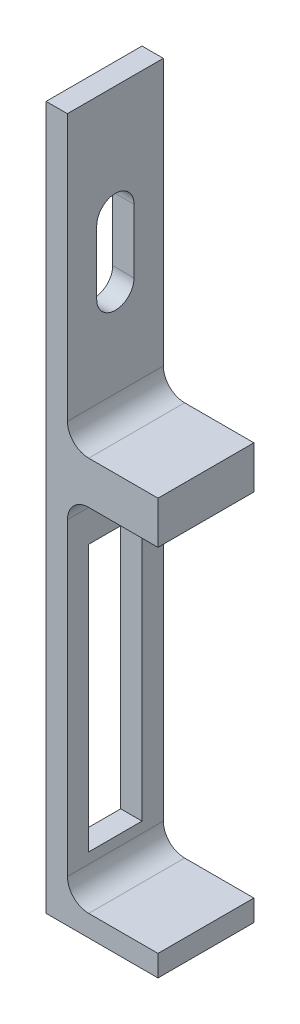
ISO-10303-21;
HEADER;
FILE_DESCRIPTION(('STEP AP214'),'2;1');
FILE_NAME('part.step','',(''),(''),'','','');
FILE_SCHEMA(('AUTOMOTIVE_DESIGN { 1 0 10303 214 1 1 1 1 }'));
ENDSEC;
DATA;
#1=APPLICATION_CONTEXT('core data for automotive mechanical design processes');
#2=APPLICATION_PROTOCOL_DEFINITION('international standard','automotive_design',2000,#1);
#3=PRODUCT_CONTEXT('',#1,'mechanical');
#4=PRODUCT('Part','Part','',(#3));
#5=PRODUCT_RELATED_PRODUCT_CATEGORY('part','',(#4));
#6=PRODUCT_DEFINITION_FORMATION('','',#4);
#7=PRODUCT_DEFINITION_CONTEXT('part definition',#1,'design');
#8=PRODUCT_DEFINITION('design','',#6,#7);
#9=PRODUCT_DEFINITION_SHAPE('','',#8);
#10=(LENGTH_UNIT() NAMED_UNIT(*) SI_UNIT(.MILLI.,.METRE.));
#11=(NAMED_UNIT(*) PLANE_ANGLE_UNIT() SI_UNIT($,.RADIAN.));
#12=(NAMED_UNIT(*) SI_UNIT($,.STERADIAN.) SOLID_ANGLE_UNIT());
#13=UNCERTAINTY_MEASURE_WITH_UNIT(LENGTH_MEASURE(1.E-05),#10,'distance_accuracy_value','');
#14=(GEOMETRIC_REPRESENTATION_CONTEXT(3) GLOBAL_UNCERTAINTY_ASSIGNED_CONTEXT((#13)) GLOBAL_UNIT_ASSIGNED_CONTEXT((#10,
#11,#12)) REPRESENTATION_CONTEXT('',''));
#15=CARTESIAN_POINT('',(0.,0.,0.));
#16=DIRECTION('',(0.,0.,1.));
#17=DIRECTION('',(1.,0.,0.));
#18=AXIS2_PLACEMENT_3D('',#15,#16,#17);
#19=CARTESIAN_POINT('',(2.,2.,9.));
#20=DIRECTION('',(-1.,0.,0.));
#21=DIRECTION('',(0.,0.,1.));
#22=AXIS2_PLACEMENT_3D('',#19,#20,#21);
#23=PLANE('',#22);
#24=DIRECTION('',(0.,1.,0.));
#25=VECTOR('',#24,1.);
#26=CARTESIAN_POINT('',(2.,2.,6.25000000000002));
#27=LINE('',#26,#25);
#28=CARTESIAN_POINT('',(2.,49.52,6.25000000000001));
#29=VERTEX_POINT('',#28);
#30=CARTESIAN_POINT('',(2.,55.52,6.25000000000001));
#31=VERTEX_POINT('',#30);
#32=EDGE_CURVE('E305',#29,#31,#27,.T.);
#33=ORIENTED_EDGE('',*,*,#32,.T.);
#34=CARTESIAN_POINT('',(2.,55.52,4.5));
#35=DIRECTION('',(-1.,0.,0.));
#36=DIRECTION('',(0.,0.,1.));
#37=AXIS2_PLACEMENT_3D('',#34,#35,#36);
#38=CIRCLE('',#37,1.75);
#39=CARTESIAN_POINT('',(2.,55.52,2.75));
#40=VERTEX_POINT('',#39);
#41=EDGE_CURVE('E308',#31,#40,#38,.T.);
#42=ORIENTED_EDGE('',*,*,#41,.T.);
#43=DIRECTION('',(0.,-1.,0.));
#44=VECTOR('',#43,1.);
#45=CARTESIAN_POINT('',(2.,2.,2.75000000000002));
#46=LINE('',#45,#44);
#47=CARTESIAN_POINT('',(2.,49.52,2.75));
#48=VERTEX_POINT('',#47);
#49=EDGE_CURVE('E299',#40,#48,#46,.T.);
#50=ORIENTED_EDGE('',*,*,#49,.T.);
#51=CARTESIAN_POINT('',(2.,49.52,4.50000000000001));
#52=DIRECTION('',(-1.,0.,0.));
#53=DIRECTION('',(0.,0.,1.));
#54=AXIS2_PLACEMENT_3D('',#51,#52,#53);
#55=CIRCLE('',#54,1.75);
#56=EDGE_CURVE('E302',#48,#29,#55,.T.);
#57=ORIENTED_EDGE('',*,*,#56,.T.);
#58=EDGE_LOOP('',(#33,#42,#50,#57));
#59=FACE_BOUND('',#58,.T.);
#60=DIRECTION('',(0.,1.,0.));
#61=VECTOR('',#60,1.);
#62=CARTESIAN_POINT('',(2.,2.,9.));
#63=LINE('',#62,#61);
#64=CARTESIAN_POINT('',(2.,41.,9.));
#65=VERTEX_POINT('',#64);
#66=CARTESIAN_POINT('',(2.,66.,9.));
#67=VERTEX_POINT('',#66);
#68=EDGE_CURVE('E265',#65,#67,#63,.T.);
#69=ORIENTED_EDGE('',*,*,#68,.F.);
#70=DIRECTION('',(0.,0.,1.));
#71=VECTOR('',#70,1.);
#72=CARTESIAN_POINT('',(2.,41.,9.));
#73=LINE('',#72,#71);
#74=CARTESIAN_POINT('',(2.,41.,0.));
#75=VERTEX_POINT('',#74);
#76=EDGE_CURVE('E323',#65,#75,#73,.F.);
#77=ORIENTED_EDGE('',*,*,#76,.T.);
#78=DIRECTION('',(0.,1.,0.));
#79=VECTOR('',#78,1.);
#80=CARTESIAN_POINT('',(2.,2.,0.));
#81=LINE('',#80,#79);
#82=CARTESIAN_POINT('',(2.,66.,0.));
#83=VERTEX_POINT('',#82);
#84=EDGE_CURVE('E280',#75,#83,#81,.T.);
#85=ORIENTED_EDGE('',*,*,#84,.T.);
#86=DIRECTION('',(0.,0.,-1.));
#87=VECTOR('',#86,1.);
#88=CARTESIAN_POINT('',(2.,66.,9.));
#89=LINE('',#88,#87);
#90=EDGE_CURVE('E287',#67,#83,#89,.T.);
#91=ORIENTED_EDGE('',*,*,#90,.F.);
#92=EDGE_LOOP('',(#69,#77,#85,#91));
#93=FACE_BOUND('',#92,.T.);
#94=ADVANCED_FACE('F37',(#59,#93),#23,.F.);
#95=CARTESIAN_POINT('',(0.,66.,9.));
#96=DIRECTION('',(1.,0.,0.));
#97=DIRECTION('',(0.,1.,0.));
#98=AXIS2_PLACEMENT_3D('',#95,#96,#97);
#99=PLANE('',#98);
#100=DIRECTION('',(0.,0.,1.));
#101=VECTOR('',#100,1.);
#102=CARTESIAN_POINT('',(0.,30.,7.));
#103=LINE('',#102,#101);
#104=CARTESIAN_POINT('',(0.,30.,2.00000000000001));
#105=VERTEX_POINT('',#104);
#106=CARTESIAN_POINT('',(0.,30.,7.));
#107=VERTEX_POINT('',#106);
#108=EDGE_CURVE('E211',#105,#107,#103,.T.);
#109=ORIENTED_EDGE('',*,*,#108,.T.);
#110=DIRECTION('',(0.,-1.,0.));
#111=VECTOR('',#110,1.);
#112=CARTESIAN_POINT('',(0.,5.,7.));
#113=LINE('',#112,#111);
#114=CARTESIAN_POINT('',(0.,5.,7.));
#115=VERTEX_POINT('',#114);
#116=EDGE_CURVE('E201',#107,#115,#113,.T.);
#117=ORIENTED_EDGE('',*,*,#116,.T.);
#118=DIRECTION('',(0.,0.,-1.));
#119=VECTOR('',#118,1.);
#120=CARTESIAN_POINT('',(0.,5.,7.));
#121=LINE('',#120,#119);
#122=CARTESIAN_POINT('',(0.,5.,2.00000000000001));
#123=VERTEX_POINT('',#122);
#124=EDGE_CURVE('E204',#115,#123,#121,.T.);
#125=ORIENTED_EDGE('',*,*,#124,.T.);
#126=DIRECTION('',(0.,1.,0.));
#127=VECTOR('',#126,1.);
#128=CARTESIAN_POINT('',(0.,5.,2.00000000000001));
#129=LINE('',#128,#127);
#130=EDGE_CURVE('E208',#123,#105,#129,.T.);
#131=ORIENTED_EDGE('',*,*,#130,.T.);
#132=EDGE_LOOP('',(#109,#117,#125,#131));
#133=FACE_BOUND('',#132,.T.);
#134=DIRECTION('',(0.,-1.,0.));
#135=VECTOR('',#134,1.);
#136=CARTESIAN_POINT('',(0.,55.52,2.75));
#137=LINE('',#136,#135);
#138=CARTESIAN_POINT('',(0.,55.52,2.75));
#139=VERTEX_POINT('',#138);
#140=CARTESIAN_POINT('',(0.,49.52,2.75));
#141=VERTEX_POINT('',#140);
#142=EDGE_CURVE('E236',#139,#141,#137,.T.);
#143=ORIENTED_EDGE('',*,*,#142,.F.);
#144=CARTESIAN_POINT('',(0.,55.52,4.5));
#145=DIRECTION('',(-1.,0.,0.));
#146=DIRECTION('',(0.,-1.,0.));
#147=AXIS2_PLACEMENT_3D('',#144,#145,#146);
#148=CIRCLE('',#147,1.75);
#149=CARTESIAN_POINT('',(0.,55.52,6.25000000000001));
#150=VERTEX_POINT('',#149);
#151=EDGE_CURVE('E228',#150,#139,#148,.T.);
#152=ORIENTED_EDGE('',*,*,#151,.F.);
#153=DIRECTION('',(0.,1.,0.));
#154=VECTOR('',#153,1.);
#155=CARTESIAN_POINT('',(0.,55.52,6.25000000000001));
#156=LINE('',#155,#154);
#157=CARTESIAN_POINT('',(0.,49.52,6.25000000000001));
#158=VERTEX_POINT('',#157);
#159=EDGE_CURVE('E242',#158,#150,#156,.T.);
#160=ORIENTED_EDGE('',*,*,#159,.F.);
#161=CARTESIAN_POINT('',(0.,49.52,4.50000000000001));
#162=DIRECTION('',(-1.,0.,0.));
#163=DIRECTION('',(0.,-1.,0.));
#164=AXIS2_PLACEMENT_3D('',#161,#162,#163);
#165=CIRCLE('',#164,1.75);
#166=EDGE_CURVE('E239',#141,#158,#165,.T.);
#167=ORIENTED_EDGE('',*,*,#166,.F.);
#168=EDGE_LOOP('',(#143,#152,#160,#167));
#169=FACE_BOUND('',#168,.T.);
#170=DIRECTION('',(0.,-1.,0.));
#171=VECTOR('',#170,1.);
#172=CARTESIAN_POINT('',(0.,66.,0.));
#173=LINE('',#172,#171);
#174=CARTESIAN_POINT('',(0.,66.,0.));
#175=VERTEX_POINT('',#174);
#176=CARTESIAN_POINT('',(0.,0.,0.));
#177=VERTEX_POINT('',#176);
#178=EDGE_CURVE('E248',#175,#177,#173,.T.);
#179=ORIENTED_EDGE('',*,*,#178,.T.);
#180=DIRECTION('',(0.,0.,-1.));
#181=VECTOR('',#180,1.);
#182=CARTESIAN_POINT('',(0.,0.,9.));
#183=LINE('',#182,#181);
#184=CARTESIAN_POINT('',(0.,0.,9.));
#185=VERTEX_POINT('',#184);
#186=EDGE_CURVE('E296',#185,#177,#183,.T.);
#187=ORIENTED_EDGE('',*,*,#186,.F.);
#188=DIRECTION('',(0.,-1.,0.));
#189=VECTOR('',#188,1.);
#190=CARTESIAN_POINT('',(0.,66.,9.));
#191=LINE('',#190,#189);
#192=CARTESIAN_POINT('',(0.,66.,9.));
#193=VERTEX_POINT('',#192);
#194=EDGE_CURVE('E255',#193,#185,#191,.T.);
#195=ORIENTED_EDGE('',*,*,#194,.F.);
#196=DIRECTION('',(0.,0.,-1.));
#197=VECTOR('',#196,1.);
#198=CARTESIAN_POINT('',(0.,66.,9.));
#199=LINE('',#198,#197);
#200=EDGE_CURVE('E270',#193,#175,#199,.T.);
#201=ORIENTED_EDGE('',*,*,#200,.T.);
#202=EDGE_LOOP('',(#179,#187,#195,#201));
#203=FACE_BOUND('',#202,.T.);
#204=ADVANCED_FACE('F358',(#133,#169,#203),#99,.F.);
#205=CARTESIAN_POINT('',(0.,0.,9.));
#206=DIRECTION('',(0.,1.,0.));
#207=DIRECTION('',(0.,0.,1.));
#208=AXIS2_PLACEMENT_3D('',#205,#206,#207);
#209=PLANE('',#208);
#210=DIRECTION('',(1.,0.,0.));
#211=VECTOR('',#210,1.);
#212=CARTESIAN_POINT('',(0.,0.,0.));
#213=LINE('',#212,#211);
#214=CARTESIAN_POINT('',(10.5,0.,0.));
#215=VERTEX_POINT('',#214);
#216=EDGE_CURVE('E273',#177,#215,#213,.T.);
#217=ORIENTED_EDGE('',*,*,#216,.T.);
#218=DIRECTION('',(0.,0.,-1.));
#219=VECTOR('',#218,1.);
#220=CARTESIAN_POINT('',(10.5,0.,9.));
#221=LINE('',#220,#219);
#222=CARTESIAN_POINT('',(10.5,0.,9.));
#223=VERTEX_POINT('',#222);
#224=EDGE_CURVE('E293',#223,#215,#221,.T.);
#225=ORIENTED_EDGE('',*,*,#224,.F.);
#226=DIRECTION('',(1.,0.,0.));
#227=VECTOR('',#226,1.);
#228=CARTESIAN_POINT('',(0.,0.,9.));
#229=LINE('',#228,#227);
#230=EDGE_CURVE('E257',#185,#223,#229,.T.);
#231=ORIENTED_EDGE('',*,*,#230,.F.);
#232=ORIENTED_EDGE('',*,*,#186,.T.);
#233=EDGE_LOOP('',(#217,#225,#231,#232));
#234=FACE_BOUND('',#233,.T.);
#235=ADVANCED_FACE('F360',(#234),#209,.F.);
#236=CARTESIAN_POINT('',(10.5,0.,9.));
#237=DIRECTION('',(-1.,0.,0.));
#238=DIRECTION('',(0.,0.,1.));
#239=AXIS2_PLACEMENT_3D('',#236,#237,#238);
#240=PLANE('',#239);
#241=DIRECTION('',(0.,1.,0.));
#242=VECTOR('',#241,1.);
#243=CARTESIAN_POINT('',(10.5,0.,0.));
#244=LINE('',#243,#242);
#245=CARTESIAN_POINT('',(10.5,2.,0.));
#246=VERTEX_POINT('',#245);
#247=EDGE_CURVE('E275',#215,#246,#244,.T.);
#248=ORIENTED_EDGE('',*,*,#247,.T.);
#249=DIRECTION('',(0.,0.,-1.));
#250=VECTOR('',#249,1.);
#251=CARTESIAN_POINT('',(10.5,2.,9.));
#252=LINE('',#251,#250);
#253=CARTESIAN_POINT('',(10.5,2.,9.));
#254=VERTEX_POINT('',#253);
#255=EDGE_CURVE('E290',#254,#246,#252,.T.);
#256=ORIENTED_EDGE('',*,*,#255,.F.);
#257=DIRECTION('',(0.,1.,0.));
#258=VECTOR('',#257,1.);
#259=CARTESIAN_POINT('',(10.5,0.,9.));
#260=LINE('',#259,#258);
#261=EDGE_CURVE('E260',#223,#254,#260,.T.);
#262=ORIENTED_EDGE('',*,*,#261,.F.);
#263=ORIENTED_EDGE('',*,*,#224,.T.);
#264=EDGE_LOOP('',(#248,#256,#262,#263));
#265=FACE_BOUND('',#264,.T.);
#266=ADVANCED_FACE('F365',(#265),#240,.F.);
#267=CARTESIAN_POINT('',(10.5,2.,9.));
#268=DIRECTION('',(0.,-1.,0.));
#269=DIRECTION('',(1.,0.,0.));
#270=AXIS2_PLACEMENT_3D('',#267,#268,#269);
#271=PLANE('',#270);
#272=DIRECTION('',(-1.,0.,0.));
#273=VECTOR('',#272,1.);
#274=CARTESIAN_POINT('',(10.5,2.,0.));
#275=LINE('',#274,#273);
#276=CARTESIAN_POINT('',(4.,2.,0.));
#277=VERTEX_POINT('',#276);
#278=EDGE_CURVE('E277',#246,#277,#275,.T.);
#279=ORIENTED_EDGE('',*,*,#278,.T.);
#280=DIRECTION('',(0.,0.,-1.));
#281=VECTOR('',#280,1.);
#282=CARTESIAN_POINT('',(4.,2.,9.));
#283=LINE('',#282,#281);
#284=CARTESIAN_POINT('',(4.,2.,9.));
#285=VERTEX_POINT('',#284);
#286=EDGE_CURVE('E314',#277,#285,#283,.F.);
#287=ORIENTED_EDGE('',*,*,#286,.T.);
#288=DIRECTION('',(-1.,0.,0.));
#289=VECTOR('',#288,1.);
#290=CARTESIAN_POINT('',(10.5,2.,9.));
#291=LINE('',#290,#289);
#292=EDGE_CURVE('E262',#254,#285,#291,.T.);
#293=ORIENTED_EDGE('',*,*,#292,.F.);
#294=ORIENTED_EDGE('',*,*,#255,.T.);
#295=EDGE_LOOP('',(#279,#287,#293,#294));
#296=FACE_BOUND('',#295,.T.);
#297=ADVANCED_FACE('F396',(#296),#271,.F.);
#298=DIRECTION('',(0.,0.,-1.));
#299=VECTOR('',#298,1.);
#300=CARTESIAN_POINT('',(2.,5.,7.));
#301=LINE('',#300,#299);
#302=CARTESIAN_POINT('',(2.,5.,7.));
#303=VERTEX_POINT('',#302);
#304=CARTESIAN_POINT('',(2.,5.,2.00000000000001));
#305=VERTEX_POINT('',#304);
#306=EDGE_CURVE('E217',#303,#305,#301,.T.);
#307=ORIENTED_EDGE('',*,*,#306,.F.);
#308=DIRECTION('',(0.,-1.,0.));
#309=VECTOR('',#308,1.);
#310=CARTESIAN_POINT('',(2.,5.,7.));
#311=LINE('',#310,#309);
#312=CARTESIAN_POINT('',(2.,30.,7.));
#313=VERTEX_POINT('',#312);
#314=EDGE_CURVE('E215',#313,#303,#311,.T.);
#315=ORIENTED_EDGE('',*,*,#314,.F.);
#316=DIRECTION('',(0.,0.,1.));
#317=VECTOR('',#316,1.);
#318=CARTESIAN_POINT('',(2.,30.,7.));
#319=LINE('',#318,#317);
#320=CARTESIAN_POINT('',(2.,30.,2.00000000000001));
#321=VERTEX_POINT('',#320);
#322=EDGE_CURVE('E205',#321,#313,#319,.T.);
#323=ORIENTED_EDGE('',*,*,#322,.F.);
#324=DIRECTION('',(0.,1.,0.));
#325=VECTOR('',#324,1.);
#326=CARTESIAN_POINT('',(2.,5.,2.00000000000001));
#327=LINE('',#326,#325);
#328=EDGE_CURVE('E221',#305,#321,#327,.T.);
#329=ORIENTED_EDGE('',*,*,#328,.F.);
#330=EDGE_LOOP('',(#307,#315,#323,#329));
#331=FACE_BOUND('',#330,.T.);
#332=CARTESIAN_POINT('',(2.,4.,0.));
#333=VERTEX_POINT('',#332);
#334=CARTESIAN_POINT('',(2.,33.,0.));
#335=VERTEX_POINT('',#334);
#336=EDGE_CURVE('E281',#333,#335,#81,.T.);
#337=ORIENTED_EDGE('',*,*,#336,.T.);
#338=DIRECTION('',(0.,0.,1.));
#339=VECTOR('',#338,1.);
#340=CARTESIAN_POINT('',(2.,33.,9.));
#341=LINE('',#340,#339);
#342=CARTESIAN_POINT('',(2.,33.,9.));
#343=VERTEX_POINT('',#342);
#344=EDGE_CURVE('E325',#335,#343,#341,.T.);
#345=ORIENTED_EDGE('',*,*,#344,.T.);
#346=CARTESIAN_POINT('',(2.,4.,9.));
#347=VERTEX_POINT('',#346);
#348=EDGE_CURVE('E266',#347,#343,#63,.T.);
#349=ORIENTED_EDGE('',*,*,#348,.F.);
#350=DIRECTION('',(0.,0.,-1.));
#351=VECTOR('',#350,1.);
#352=CARTESIAN_POINT('',(2.,4.,0.));
#353=LINE('',#352,#351);
#354=EDGE_CURVE('E311',#347,#333,#353,.T.);
#355=ORIENTED_EDGE('',*,*,#354,.T.);
#356=EDGE_LOOP('',(#337,#345,#349,#355));
#357=FACE_BOUND('',#356,.T.);
#358=ADVANCED_FACE('F376',(#331,#357),#23,.F.);
#359=CARTESIAN_POINT('',(2.,66.,9.));
#360=DIRECTION('',(0.,-1.,0.));
#361=DIRECTION('',(0.,0.,-1.));
#362=AXIS2_PLACEMENT_3D('',#359,#360,#361);
#363=PLANE('',#362);
#364=DIRECTION('',(-1.,0.,0.));
#365=VECTOR('',#364,1.);
#366=CARTESIAN_POINT('',(2.,66.,0.));
#367=LINE('',#366,#365);
#368=EDGE_CURVE('E258',#83,#175,#367,.T.);
#369=ORIENTED_EDGE('',*,*,#368,.T.);
#370=ORIENTED_EDGE('',*,*,#200,.F.);
#371=DIRECTION('',(-1.,0.,0.));
#372=VECTOR('',#371,1.);
#373=CARTESIAN_POINT('',(2.,66.,9.));
#374=LINE('',#373,#372);
#375=EDGE_CURVE('E268',#67,#193,#374,.T.);
#376=ORIENTED_EDGE('',*,*,#375,.F.);
#377=ORIENTED_EDGE('',*,*,#90,.T.);
#378=EDGE_LOOP('',(#369,#370,#376,#377));
#379=FACE_BOUND('',#378,.T.);
#380=ADVANCED_FACE('F353',(#379),#363,.F.);
#381=CARTESIAN_POINT('',(0.,0.,9.));
#382=DIRECTION('',(0.,0.,1.));
#383=DIRECTION('',(1.,0.,0.));
#384=AXIS2_PLACEMENT_3D('',#381,#382,#383);
#385=PLANE('',#384);
#386=ORIENTED_EDGE('',*,*,#194,.T.);
#387=ORIENTED_EDGE('',*,*,#230,.T.);
#388=ORIENTED_EDGE('',*,*,#261,.T.);
#389=ORIENTED_EDGE('',*,*,#292,.T.);
#390=CARTESIAN_POINT('',(4.,4.,9.));
#391=DIRECTION('',(0.,0.,1.));
#392=DIRECTION('',(1.,0.,0.));
#393=AXIS2_PLACEMENT_3D('',#390,#391,#392);
#394=CIRCLE('',#393,2.);
#395=EDGE_CURVE('E318',#285,#347,#394,.F.);
#396=ORIENTED_EDGE('',*,*,#395,.T.);
#397=ORIENTED_EDGE('',*,*,#348,.T.);
#398=CARTESIAN_POINT('',(4.,33.,9.));
#399=DIRECTION('',(0.,0.,1.));
#400=DIRECTION('',(1.,0.,0.));
#401=AXIS2_PLACEMENT_3D('',#398,#399,#400);
#402=CIRCLE('',#401,2.);
#403=CARTESIAN_POINT('',(4.,35.,9.));
#404=VERTEX_POINT('',#403);
#405=EDGE_CURVE('E45',#343,#404,#402,.F.);
#406=ORIENTED_EDGE('',*,*,#405,.T.);
#407=DIRECTION('',(1.,0.,0.));
#408=VECTOR('',#407,1.);
#409=CARTESIAN_POINT('',(2.,35.,9.));
#410=LINE('',#409,#408);
#411=CARTESIAN_POINT('',(10.5,35.,9.));
#412=VERTEX_POINT('',#411);
#413=EDGE_CURVE('E177',#404,#412,#410,.T.);
#414=ORIENTED_EDGE('',*,*,#413,.T.);
#415=DIRECTION('',(0.,1.,0.));
#416=VECTOR('',#415,1.);
#417=CARTESIAN_POINT('',(10.5,39.,9.));
#418=LINE('',#417,#416);
#419=CARTESIAN_POINT('',(10.5,39.,9.));
#420=VERTEX_POINT('',#419);
#421=EDGE_CURVE('E183',#412,#420,#418,.T.);
#422=ORIENTED_EDGE('',*,*,#421,.T.);
#423=DIRECTION('',(-1.,0.,0.));
#424=VECTOR('',#423,1.);
#425=CARTESIAN_POINT('',(2.,39.,9.));
#426=LINE('',#425,#424);
#427=CARTESIAN_POINT('',(4.,39.,9.));
#428=VERTEX_POINT('',#427);
#429=EDGE_CURVE('E184',#420,#428,#426,.T.);
#430=ORIENTED_EDGE('',*,*,#429,.T.);
#431=CARTESIAN_POINT('',(4.,41.,9.));
#432=DIRECTION('',(0.,0.,1.));
#433=DIRECTION('',(1.,0.,0.));
#434=AXIS2_PLACEMENT_3D('',#431,#432,#433);
#435=CIRCLE('',#434,2.);
#436=EDGE_CURVE('E329',#428,#65,#435,.F.);
#437=ORIENTED_EDGE('',*,*,#436,.T.);
#438=ORIENTED_EDGE('',*,*,#68,.T.);
#439=ORIENTED_EDGE('',*,*,#375,.T.);
#440=EDGE_LOOP('',(#386,#387,#388,#389,#396,#397,#406,#414,#422,#430,#437,#438,#439));
#441=FACE_BOUND('',#440,.T.);
#442=ADVANCED_FACE('F180',(#441),#385,.T.);
#443=CARTESIAN_POINT('',(0.,0.,0.));
#444=DIRECTION('',(0.,0.,1.));
#445=DIRECTION('',(1.,0.,0.));
#446=AXIS2_PLACEMENT_3D('',#443,#444,#445);
#447=PLANE('',#446);
#448=ORIENTED_EDGE('',*,*,#178,.F.);
#449=ORIENTED_EDGE('',*,*,#368,.F.);
#450=ORIENTED_EDGE('',*,*,#84,.F.);
#451=CARTESIAN_POINT('',(4.,41.,0.));
#452=DIRECTION('',(0.,0.,1.));
#453=DIRECTION('',(1.,0.,0.));
#454=AXIS2_PLACEMENT_3D('',#451,#452,#453);
#455=CIRCLE('',#454,2.);
#456=CARTESIAN_POINT('',(4.,39.,0.));
#457=VERTEX_POINT('',#456);
#458=EDGE_CURVE('E331',#75,#457,#455,.T.);
#459=ORIENTED_EDGE('',*,*,#458,.T.);
#460=DIRECTION('',(1.,0.,0.));
#461=VECTOR('',#460,1.);
#462=CARTESIAN_POINT('',(2.,39.,0.));
#463=LINE('',#462,#461);
#464=CARTESIAN_POINT('',(10.5,39.,0.));
#465=VERTEX_POINT('',#464);
#466=EDGE_CURVE('E218',#457,#465,#463,.T.);
#467=ORIENTED_EDGE('',*,*,#466,.T.);
#468=DIRECTION('',(0.,-1.,0.));
#469=VECTOR('',#468,1.);
#470=CARTESIAN_POINT('',(10.5,39.,0.));
#471=LINE('',#470,#469);
#472=CARTESIAN_POINT('',(10.5,35.,0.));
#473=VERTEX_POINT('',#472);
#474=EDGE_CURVE('E344',#465,#473,#471,.T.);
#475=ORIENTED_EDGE('',*,*,#474,.T.);
#476=DIRECTION('',(-1.,0.,0.));
#477=VECTOR('',#476,1.);
#478=CARTESIAN_POINT('',(2.,35.,0.));
#479=LINE('',#478,#477);
#480=CARTESIAN_POINT('',(4.,35.,0.));
#481=VERTEX_POINT('',#480);
#482=EDGE_CURVE('E189',#473,#481,#479,.T.);
#483=ORIENTED_EDGE('',*,*,#482,.T.);
#484=CARTESIAN_POINT('',(4.,33.,0.));
#485=DIRECTION('',(0.,0.,1.));
#486=DIRECTION('',(1.,0.,0.));
#487=AXIS2_PLACEMENT_3D('',#484,#485,#486);
#488=CIRCLE('',#487,2.);
#489=EDGE_CURVE('E11',#481,#335,#488,.T.);
#490=ORIENTED_EDGE('',*,*,#489,.T.);
#491=ORIENTED_EDGE('',*,*,#336,.F.);
#492=CARTESIAN_POINT('',(4.,4.,0.));
#493=DIRECTION('',(0.,0.,1.));
#494=DIRECTION('',(1.,0.,0.));
#495=AXIS2_PLACEMENT_3D('',#492,#493,#494);
#496=CIRCLE('',#495,2.);
#497=EDGE_CURVE('E316',#333,#277,#496,.T.);
#498=ORIENTED_EDGE('',*,*,#497,.T.);
#499=ORIENTED_EDGE('',*,*,#278,.F.);
#500=ORIENTED_EDGE('',*,*,#247,.F.);
#501=ORIENTED_EDGE('',*,*,#216,.F.);
#502=EDGE_LOOP('',(#448,#449,#450,#459,#467,#475,#483,#490,#491,#498,#499,#500,#501));
#503=FACE_BOUND('',#502,.T.);
#504=ADVANCED_FACE('F337',(#503),#447,.F.);
#505=CARTESIAN_POINT('',(10.5,55.52,4.5));
#506=DIRECTION('',(-1.,0.,0.));
#507=DIRECTION('',(0.,-1.,0.));
#508=AXIS2_PLACEMENT_3D('',#505,#506,#507);
#509=CYLINDRICAL_SURFACE('',#508,1.75);
#510=DIRECTION('',(-1.,0.,0.));
#511=VECTOR('',#510,1.);
#512=CARTESIAN_POINT('',(10.5,55.52,6.25000000000001));
#513=LINE('',#512,#511);
#514=EDGE_CURVE('E246',#31,#150,#513,.T.);
#515=ORIENTED_EDGE('',*,*,#514,.T.);
#516=ORIENTED_EDGE('',*,*,#151,.T.);
#517=DIRECTION('',(-1.,0.,0.));
#518=VECTOR('',#517,1.);
#519=CARTESIAN_POINT('',(10.5,55.52,2.75));
#520=LINE('',#519,#518);
#521=EDGE_CURVE('E245',#40,#139,#520,.T.);
#522=ORIENTED_EDGE('',*,*,#521,.F.);
#523=ORIENTED_EDGE('',*,*,#41,.F.);
#524=EDGE_LOOP('',(#515,#516,#522,#523));
#525=FACE_BOUND('',#524,.T.);
#526=ADVANCED_FACE('F428',(#525),#509,.F.);
#527=CARTESIAN_POINT('',(10.5,55.52,6.25000000000001));
#528=DIRECTION('',(0.,0.,1.));
#529=DIRECTION('',(0.,-1.,0.));
#530=AXIS2_PLACEMENT_3D('',#527,#528,#529);
#531=PLANE('',#530);
#532=DIRECTION('',(-1.,0.,0.));
#533=VECTOR('',#532,1.);
#534=CARTESIAN_POINT('',(10.5,49.52,6.25000000000001));
#535=LINE('',#534,#533);
#536=EDGE_CURVE('E249',#29,#158,#535,.T.);
#537=ORIENTED_EDGE('',*,*,#536,.T.);
#538=ORIENTED_EDGE('',*,*,#159,.T.);
#539=ORIENTED_EDGE('',*,*,#514,.F.);
#540=ORIENTED_EDGE('',*,*,#32,.F.);
#541=EDGE_LOOP('',(#537,#538,#539,#540));
#542=FACE_BOUND('',#541,.T.);
#543=ADVANCED_FACE('F432',(#542),#531,.F.);
#544=CARTESIAN_POINT('',(10.5,49.52,4.50000000000001));
#545=DIRECTION('',(-1.,0.,0.));
#546=DIRECTION('',(0.,-1.,0.));
#547=AXIS2_PLACEMENT_3D('',#544,#545,#546);
#548=CYLINDRICAL_SURFACE('',#547,1.75);
#549=DIRECTION('',(-1.,0.,0.));
#550=VECTOR('',#549,1.);
#551=CARTESIAN_POINT('',(10.5,49.52,2.75));
#552=LINE('',#551,#550);
#553=EDGE_CURVE('E251',#48,#141,#552,.T.);
#554=ORIENTED_EDGE('',*,*,#553,.T.);
#555=ORIENTED_EDGE('',*,*,#166,.T.);
#556=ORIENTED_EDGE('',*,*,#536,.F.);
#557=ORIENTED_EDGE('',*,*,#56,.F.);
#558=EDGE_LOOP('',(#554,#555,#556,#557));
#559=FACE_BOUND('',#558,.T.);
#560=ADVANCED_FACE('F434',(#559),#548,.F.);
#561=CARTESIAN_POINT('',(10.5,55.52,2.75));
#562=DIRECTION('',(0.,0.,-1.));
#563=DIRECTION('',(0.,1.,0.));
#564=AXIS2_PLACEMENT_3D('',#561,#562,#563);
#565=PLANE('',#564);
#566=ORIENTED_EDGE('',*,*,#521,.T.);
#567=ORIENTED_EDGE('',*,*,#142,.T.);
#568=ORIENTED_EDGE('',*,*,#553,.F.);
#569=ORIENTED_EDGE('',*,*,#49,.F.);
#570=EDGE_LOOP('',(#566,#567,#568,#569));
#571=FACE_BOUND('',#570,.T.);
#572=ADVANCED_FACE('F424',(#571),#565,.F.);
#573=CARTESIAN_POINT('',(0.,5.,7.));
#574=DIRECTION('',(0.,0.,1.));
#575=DIRECTION('',(0.,-1.,0.));
#576=AXIS2_PLACEMENT_3D('',#573,#574,#575);
#577=PLANE('',#576);
#578=ORIENTED_EDGE('',*,*,#314,.T.);
#579=DIRECTION('',(1.,0.,0.));
#580=VECTOR('',#579,1.);
#581=CARTESIAN_POINT('',(0.,5.,7.));
#582=LINE('',#581,#580);
#583=EDGE_CURVE('E214',#115,#303,#582,.T.);
#584=ORIENTED_EDGE('',*,*,#583,.F.);
#585=ORIENTED_EDGE('',*,*,#116,.F.);
#586=DIRECTION('',(1.,0.,0.));
#587=VECTOR('',#586,1.);
#588=CARTESIAN_POINT('',(0.,30.,7.));
#589=LINE('',#588,#587);
#590=EDGE_CURVE('E226',#107,#313,#589,.T.);
#591=ORIENTED_EDGE('',*,*,#590,.T.);
#592=EDGE_LOOP('',(#578,#584,#585,#591));
#593=FACE_BOUND('',#592,.T.);
#594=ADVANCED_FACE('F412',(#593),#577,.F.);
#595=CARTESIAN_POINT('',(0.,30.,7.));
#596=DIRECTION('',(0.,1.,0.));
#597=DIRECTION('',(0.,0.,1.));
#598=AXIS2_PLACEMENT_3D('',#595,#596,#597);
#599=PLANE('',#598);
#600=ORIENTED_EDGE('',*,*,#322,.T.);
#601=ORIENTED_EDGE('',*,*,#590,.F.);
#602=ORIENTED_EDGE('',*,*,#108,.F.);
#603=DIRECTION('',(1.,0.,0.));
#604=VECTOR('',#603,1.);
#605=CARTESIAN_POINT('',(0.,30.,2.00000000000001));
#606=LINE('',#605,#604);
#607=EDGE_CURVE('E229',#105,#321,#606,.T.);
#608=ORIENTED_EDGE('',*,*,#607,.T.);
#609=EDGE_LOOP('',(#600,#601,#602,#608));
#610=FACE_BOUND('',#609,.T.);
#611=ADVANCED_FACE('F415',(#610),#599,.F.);
#612=CARTESIAN_POINT('',(0.,5.,2.00000000000001));
#613=DIRECTION('',(0.,0.,-1.));
#614=DIRECTION('',(0.,1.,0.));
#615=AXIS2_PLACEMENT_3D('',#612,#613,#614);
#616=PLANE('',#615);
#617=ORIENTED_EDGE('',*,*,#328,.T.);
#618=ORIENTED_EDGE('',*,*,#607,.F.);
#619=ORIENTED_EDGE('',*,*,#130,.F.);
#620=DIRECTION('',(1.,0.,0.));
#621=VECTOR('',#620,1.);
#622=CARTESIAN_POINT('',(0.,5.,2.00000000000001));
#623=LINE('',#622,#621);
#624=EDGE_CURVE('E231',#123,#305,#623,.T.);
#625=ORIENTED_EDGE('',*,*,#624,.T.);
#626=EDGE_LOOP('',(#617,#618,#619,#625));
#627=FACE_BOUND('',#626,.T.);
#628=ADVANCED_FACE('F417',(#627),#616,.F.);
#629=CARTESIAN_POINT('',(0.,5.,7.));
#630=DIRECTION('',(0.,-1.,0.));
#631=DIRECTION('',(0.,0.,-1.));
#632=AXIS2_PLACEMENT_3D('',#629,#630,#631);
#633=PLANE('',#632);
#634=ORIENTED_EDGE('',*,*,#306,.T.);
#635=ORIENTED_EDGE('',*,*,#624,.F.);
#636=ORIENTED_EDGE('',*,*,#124,.F.);
#637=ORIENTED_EDGE('',*,*,#583,.T.);
#638=EDGE_LOOP('',(#634,#635,#636,#637));
#639=FACE_BOUND('',#638,.T.);
#640=ADVANCED_FACE('F408',(#639),#633,.F.);
#641=CARTESIAN_POINT('',(4.,4.,9.));
#642=DIRECTION('',(0.,0.,1.));
#643=DIRECTION('',(1.,0.,0.));
#644=AXIS2_PLACEMENT_3D('',#641,#642,#643);
#645=CYLINDRICAL_SURFACE('',#644,2.);
#646=ORIENTED_EDGE('',*,*,#395,.F.);
#647=ORIENTED_EDGE('',*,*,#286,.F.);
#648=ORIENTED_EDGE('',*,*,#497,.F.);
#649=ORIENTED_EDGE('',*,*,#354,.F.);
#650=EDGE_LOOP('',(#646,#647,#648,#649));
#651=FACE_BOUND('',#650,.T.);
#652=ADVANCED_FACE('F373',(#651),#645,.F.);
#653=CARTESIAN_POINT('',(2.,39.,-9.39414711402797));
#654=DIRECTION('',(0.,1.,0.));
#655=DIRECTION('',(0.,0.,1.));
#656=AXIS2_PLACEMENT_3D('',#653,#654,#655);
#657=PLANE('',#656);
#658=ORIENTED_EDGE('',*,*,#466,.F.);
#659=DIRECTION('',(0.,0.,1.));
#660=VECTOR('',#659,1.);
#661=CARTESIAN_POINT('',(4.,39.,-9.39414711402797));
#662=LINE('',#661,#660);
#663=EDGE_CURVE('E320',#457,#428,#662,.T.);
#664=ORIENTED_EDGE('',*,*,#663,.T.);
#665=ORIENTED_EDGE('',*,*,#429,.F.);
#666=DIRECTION('',(0.,0.,1.));
#667=VECTOR('',#666,1.);
#668=CARTESIAN_POINT('',(10.5,39.,-9.39414711402797));
#669=LINE('',#668,#667);
#670=EDGE_CURVE('E192',#465,#420,#669,.T.);
#671=ORIENTED_EDGE('',*,*,#670,.F.);
#672=EDGE_LOOP('',(#658,#664,#665,#671));
#673=FACE_BOUND('',#672,.T.);
#674=ADVANCED_FACE('F343',(#673),#657,.T.);
#675=CARTESIAN_POINT('',(10.5,39.,-9.39414711402797));
#676=DIRECTION('',(1.,0.,0.));
#677=DIRECTION('',(0.,0.,-1.));
#678=AXIS2_PLACEMENT_3D('',#675,#676,#677);
#679=PLANE('',#678);
#680=ORIENTED_EDGE('',*,*,#474,.F.);
#681=ORIENTED_EDGE('',*,*,#670,.T.);
#682=ORIENTED_EDGE('',*,*,#421,.F.);
#683=DIRECTION('',(0.,0.,1.));
#684=VECTOR('',#683,1.);
#685=CARTESIAN_POINT('',(10.5,35.,-9.39414711402797));
#686=LINE('',#685,#684);
#687=EDGE_CURVE('E187',#473,#412,#686,.T.);
#688=ORIENTED_EDGE('',*,*,#687,.F.);
#689=EDGE_LOOP('',(#680,#681,#682,#688));
#690=FACE_BOUND('',#689,.T.);
#691=ADVANCED_FACE('F194',(#690),#679,.T.);
#692=CARTESIAN_POINT('',(2.,35.,-9.39414711402797));
#693=DIRECTION('',(0.,-1.,0.));
#694=DIRECTION('',(0.,0.,-1.));
#695=AXIS2_PLACEMENT_3D('',#692,#693,#694);
#696=PLANE('',#695);
#697=ORIENTED_EDGE('',*,*,#413,.F.);
#698=DIRECTION('',(0.,0.,1.));
#699=VECTOR('',#698,1.);
#700=CARTESIAN_POINT('',(4.,35.,-9.39414711402797));
#701=LINE('',#700,#699);
#702=EDGE_CURVE('E58',#404,#481,#701,.F.);
#703=ORIENTED_EDGE('',*,*,#702,.T.);
#704=ORIENTED_EDGE('',*,*,#482,.F.);
#705=ORIENTED_EDGE('',*,*,#687,.T.);
#706=EDGE_LOOP('',(#697,#703,#704,#705));
#707=FACE_BOUND('',#706,.T.);
#708=ADVANCED_FACE('F188',(#707),#696,.T.);
#709=CARTESIAN_POINT('',(4.,41.,-9.39414711402797));
#710=DIRECTION('',(0.,0.,1.));
#711=DIRECTION('',(1.,0.,0.));
#712=AXIS2_PLACEMENT_3D('',#709,#710,#711);
#713=CYLINDRICAL_SURFACE('',#712,2.);
#714=ORIENTED_EDGE('',*,*,#458,.F.);
#715=ORIENTED_EDGE('',*,*,#76,.F.);
#716=ORIENTED_EDGE('',*,*,#436,.F.);
#717=ORIENTED_EDGE('',*,*,#663,.F.);
#718=EDGE_LOOP('',(#714,#715,#716,#717));
#719=FACE_BOUND('',#718,.T.);
#720=ADVANCED_FACE('F346',(#719),#713,.F.);
#721=CARTESIAN_POINT('',(4.,33.,9.));
#722=DIRECTION('',(0.,0.,1.));
#723=DIRECTION('',(1.,0.,0.));
#724=AXIS2_PLACEMENT_3D('',#721,#722,#723);
#725=CYLINDRICAL_SURFACE('',#724,2.);
#726=ORIENTED_EDGE('',*,*,#489,.F.);
#727=ORIENTED_EDGE('',*,*,#702,.F.);
#728=ORIENTED_EDGE('',*,*,#405,.F.);
#729=ORIENTED_EDGE('',*,*,#344,.F.);
#730=EDGE_LOOP('',(#726,#727,#728,#729));
#731=FACE_BOUND('',#730,.T.);
#732=ADVANCED_FACE('F39',(#731),#725,.F.);
#733=CLOSED_SHELL('',(#94,#204,#235,#266,#297,#358,#380,#442,#504,#526,#543,#560,#572,#594,#611,
#628,#640,#652,#674,#691,#708,#720,#732));
#734=MANIFOLD_SOLID_BREP('B2',#733);
#735=ADVANCED_BREP_SHAPE_REPRESENTATION('',(#18,#734),#14);
#736=SHAPE_DEFINITION_REPRESENTATION(#9,#735);
ENDSEC;
END-ISO-10303-21;
